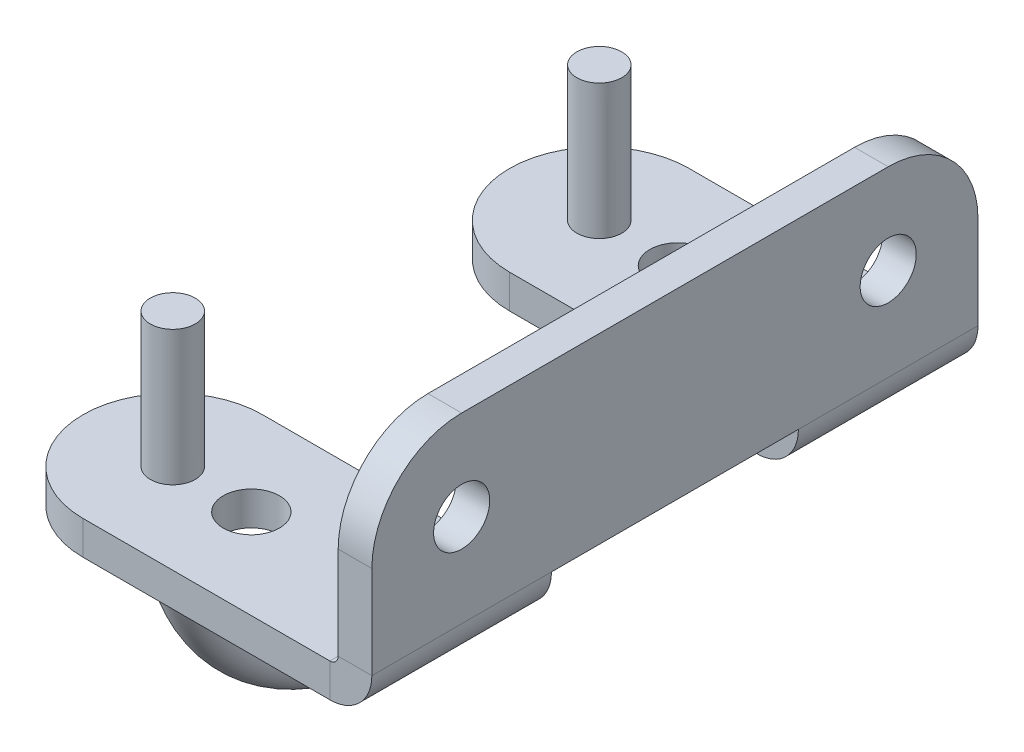
ISO-10303-21;
HEADER;
FILE_DESCRIPTION(('STEP AP214'),'2;1');
FILE_NAME('part.step','',(''),(''),'','','');
FILE_SCHEMA(('AUTOMOTIVE_DESIGN { 1 0 10303 214 1 1 1 1 }'));
ENDSEC;
DATA;
#1=APPLICATION_CONTEXT('core data for automotive mechanical design processes');
#2=APPLICATION_PROTOCOL_DEFINITION('international standard','automotive_design',2000,#1);
#3=PRODUCT_CONTEXT('',#1,'mechanical');
#4=PRODUCT('Part','Part','',(#3));
#5=PRODUCT_RELATED_PRODUCT_CATEGORY('part','',(#4));
#6=PRODUCT_DEFINITION_FORMATION('','',#4);
#7=PRODUCT_DEFINITION_CONTEXT('part definition',#1,'design');
#8=PRODUCT_DEFINITION('design','',#6,#7);
#9=PRODUCT_DEFINITION_SHAPE('','',#8);
#10=(LENGTH_UNIT() NAMED_UNIT(*) SI_UNIT(.MILLI.,.METRE.));
#11=(NAMED_UNIT(*) PLANE_ANGLE_UNIT() SI_UNIT($,.RADIAN.));
#12=(NAMED_UNIT(*) SI_UNIT($,.STERADIAN.) SOLID_ANGLE_UNIT());
#13=UNCERTAINTY_MEASURE_WITH_UNIT(LENGTH_MEASURE(1.E-05),#10,'distance_accuracy_value','');
#14=(GEOMETRIC_REPRESENTATION_CONTEXT(3) GLOBAL_UNCERTAINTY_ASSIGNED_CONTEXT((#13)) GLOBAL_UNIT_ASSIGNED_CONTEXT((#10,
#11,#12)) REPRESENTATION_CONTEXT('',''));
#15=CARTESIAN_POINT('',(0.,0.,0.));
#16=DIRECTION('',(0.,0.,1.));
#17=DIRECTION('',(1.,0.,0.));
#18=AXIS2_PLACEMENT_3D('',#15,#16,#17);
#19=CARTESIAN_POINT('',(25.7366,8.99999999999998,-38.));
#20=DIRECTION('',(-1.,0.,0.));
#21=DIRECTION('',(0.,-1.,0.));
#22=AXIS2_PLACEMENT_3D('',#19,#20,#21);
#23=CYLINDRICAL_SURFACE('',#22,8.);
#24=DIRECTION('',(-1.,0.,0.));
#25=VECTOR('',#24,1.);
#26=CARTESIAN_POINT('',(18.7366000000001,17.,-38.));
#27=LINE('',#26,#25);
#28=CARTESIAN_POINT('',(18.7366000000001,17.,-38.));
#29=VERTEX_POINT('',#28);
#30=CARTESIAN_POINT('',(15.7366000000001,17.,-38.));
#31=VERTEX_POINT('',#30);
#32=EDGE_CURVE('E309',#29,#31,#27,.T.);
#33=ORIENTED_EDGE('',*,*,#32,.F.);
#34=CARTESIAN_POINT('',(18.7366,9.,-38.));
#35=DIRECTION('',(1.,0.,0.));
#36=DIRECTION('',(0.,-1.,0.));
#37=AXIS2_PLACEMENT_3D('',#34,#35,#36);
#38=CIRCLE('',#37,8.);
#39=CARTESIAN_POINT('',(18.7366,9.00000000000001,-46.));
#40=VERTEX_POINT('',#39);
#41=EDGE_CURVE('E322',#29,#40,#38,.F.);
#42=ORIENTED_EDGE('',*,*,#41,.T.);
#43=DIRECTION('',(-1.,0.,0.));
#44=VECTOR('',#43,1.);
#45=CARTESIAN_POINT('',(25.7366,8.99999999999998,-46.));
#46=LINE('',#45,#44);
#47=CARTESIAN_POINT('',(15.7366,9.00000000000002,-46.));
#48=VERTEX_POINT('',#47);
#49=EDGE_CURVE('E372',#48,#40,#46,.F.);
#50=ORIENTED_EDGE('',*,*,#49,.F.);
#51=CARTESIAN_POINT('',(15.7366,9.00000000000001,-38.));
#52=DIRECTION('',(1.,0.,0.));
#53=DIRECTION('',(0.,-1.,0.));
#54=AXIS2_PLACEMENT_3D('',#51,#52,#53);
#55=CIRCLE('',#54,8.);
#56=EDGE_CURVE('E320',#31,#48,#55,.F.);
#57=ORIENTED_EDGE('',*,*,#56,.F.);
#58=EDGE_LOOP('',(#33,#42,#50,#57));
#59=FACE_BOUND('',#58,.T.);
#60=ADVANCED_FACE('F89',(#59),#23,.T.);
#61=CARTESIAN_POINT('',(18.7366,0.,-38.));
#62=DIRECTION('',(-1.,0.,0.));
#63=DIRECTION('',(0.,-1.,0.));
#64=AXIS2_PLACEMENT_3D('',#61,#62,#63);
#65=PLANE('',#64);
#66=DIRECTION('',(0.,0.,-1.));
#67=VECTOR('',#66,1.);
#68=CARTESIAN_POINT('',(18.7366,0.736599999999987,8.));
#69=LINE('',#68,#67);
#70=CARTESIAN_POINT('',(18.7366,0.736599999999985,-8.));
#71=VERTEX_POINT('',#70);
#72=CARTESIAN_POINT('',(18.7366,0.736599999999986,8.));
#73=VERTEX_POINT('',#72);
#74=EDGE_CURVE('E239',#71,#73,#69,.F.);
#75=ORIENTED_EDGE('',*,*,#74,.F.);
#76=DIRECTION('',(0.,0.,1.));
#77=VECTOR('',#76,1.);
#78=CARTESIAN_POINT('',(18.7366,0.736599999999985,-8.));
#79=LINE('',#78,#77);
#80=CARTESIAN_POINT('',(18.7366,0.736599999999985,-30.));
#81=VERTEX_POINT('',#80);
#82=EDGE_CURVE('E301',#81,#71,#79,.T.);
#83=ORIENTED_EDGE('',*,*,#82,.F.);
#84=DIRECTION('',(0.,0.,1.));
#85=VECTOR('',#84,1.);
#86=CARTESIAN_POINT('',(18.7366,0.736599999999987,-46.));
#87=LINE('',#86,#85);
#88=CARTESIAN_POINT('',(18.7366,0.736599999999986,-46.));
#89=VERTEX_POINT('',#88);
#90=EDGE_CURVE('E332',#81,#89,#87,.F.);
#91=ORIENTED_EDGE('',*,*,#90,.T.);
#92=DIRECTION('',(0.,-1.,0.));
#93=VECTOR('',#92,1.);
#94=CARTESIAN_POINT('',(18.7366,0.,-46.));
#95=LINE('',#94,#93);
#96=EDGE_CURVE('E325',#40,#89,#95,.T.);
#97=ORIENTED_EDGE('',*,*,#96,.F.);
#98=ORIENTED_EDGE('',*,*,#41,.F.);
#99=DIRECTION('',(0.,0.,-1.));
#100=VECTOR('',#99,1.);
#101=CARTESIAN_POINT('',(18.7366000000001,17.,-38.));
#102=LINE('',#101,#100);
#103=CARTESIAN_POINT('',(18.7366000000001,17.,0.));
#104=VERTEX_POINT('',#103);
#105=EDGE_CURVE('E304',#104,#29,#102,.T.);
#106=ORIENTED_EDGE('',*,*,#105,.F.);
#107=CARTESIAN_POINT('',(18.7366,9.,0.));
#108=DIRECTION('',(-1.,0.,0.));
#109=DIRECTION('',(0.,-1.,0.));
#110=AXIS2_PLACEMENT_3D('',#107,#108,#109);
#111=CIRCLE('',#110,8.);
#112=CARTESIAN_POINT('',(18.7366,9.00000000000001,8.));
#113=VERTEX_POINT('',#112);
#114=EDGE_CURVE('E221',#104,#113,#111,.F.);
#115=ORIENTED_EDGE('',*,*,#114,.T.);
#116=DIRECTION('',(0.,-1.,0.));
#117=VECTOR('',#116,1.);
#118=CARTESIAN_POINT('',(18.7366,0.,8.));
#119=LINE('',#118,#117);
#120=EDGE_CURVE('E229',#113,#73,#119,.T.);
#121=ORIENTED_EDGE('',*,*,#120,.T.);
#122=EDGE_LOOP('',(#75,#83,#91,#97,#98,#106,#115,#121));
#123=FACE_BOUND('',#122,.T.);
#124=CARTESIAN_POINT('',(18.7366,9.,-38.));
#125=DIRECTION('',(1.,0.,0.));
#126=DIRECTION('',(0.,-1.,0.));
#127=AXIS2_PLACEMENT_3D('',#124,#125,#126);
#128=CIRCLE('',#127,2.5);
#129=CARTESIAN_POINT('',(18.7366,6.5,-38.));
#130=VERTEX_POINT('',#129);
#131=EDGE_CURVE('E317',#130,#130,#128,.T.);
#132=ORIENTED_EDGE('',*,*,#131,.F.);
#133=EDGE_LOOP('',(#132));
#134=FACE_BOUND('',#133,.T.);
#135=CARTESIAN_POINT('',(18.7366,9.,0.));
#136=DIRECTION('',(-1.,0.,0.));
#137=DIRECTION('',(0.,-1.,0.));
#138=AXIS2_PLACEMENT_3D('',#135,#136,#137);
#139=CIRCLE('',#138,2.5);
#140=CARTESIAN_POINT('',(18.7366,6.5,0.));
#141=VERTEX_POINT('',#140);
#142=EDGE_CURVE('E222',#141,#141,#139,.T.);
#143=ORIENTED_EDGE('',*,*,#142,.T.);
#144=EDGE_LOOP('',(#143));
#145=FACE_BOUND('',#144,.T.);
#146=ADVANCED_FACE('F411',(#123,#134,#145),#65,.F.);
#147=CARTESIAN_POINT('',(15.7366,0.,-38.));
#148=DIRECTION('',(-1.,0.,0.));
#149=DIRECTION('',(0.,-1.,0.));
#150=AXIS2_PLACEMENT_3D('',#147,#148,#149);
#151=PLANE('',#150);
#152=DIRECTION('',(0.,0.,1.));
#153=VECTOR('',#152,1.);
#154=CARTESIAN_POINT('',(15.7366,0.736599999999996,-8.));
#155=LINE('',#154,#153);
#156=CARTESIAN_POINT('',(15.7366,0.736599999999996,-30.));
#157=VERTEX_POINT('',#156);
#158=CARTESIAN_POINT('',(15.7366,0.736599999999996,-8.));
#159=VERTEX_POINT('',#158);
#160=EDGE_CURVE('E230',#157,#159,#155,.T.);
#161=ORIENTED_EDGE('',*,*,#160,.T.);
#162=DIRECTION('',(0.,0.,-1.));
#163=VECTOR('',#162,1.);
#164=CARTESIAN_POINT('',(15.7366,0.736599999999997,8.));
#165=LINE('',#164,#163);
#166=CARTESIAN_POINT('',(15.7366,0.736599999999997,8.));
#167=VERTEX_POINT('',#166);
#168=EDGE_CURVE('E238',#167,#159,#165,.T.);
#169=ORIENTED_EDGE('',*,*,#168,.F.);
#170=DIRECTION('',(0.,1.,0.));
#171=VECTOR('',#170,1.);
#172=CARTESIAN_POINT('',(15.7366,0.,8.));
#173=LINE('',#172,#171);
#174=CARTESIAN_POINT('',(15.7366,9.00000000000002,8.));
#175=VERTEX_POINT('',#174);
#176=EDGE_CURVE('E227',#175,#167,#173,.F.);
#177=ORIENTED_EDGE('',*,*,#176,.F.);
#178=CARTESIAN_POINT('',(15.7366,9.00000000000001,0.));
#179=DIRECTION('',(-1.,0.,0.));
#180=DIRECTION('',(0.,-1.,0.));
#181=AXIS2_PLACEMENT_3D('',#178,#179,#180);
#182=CIRCLE('',#181,8.);
#183=CARTESIAN_POINT('',(15.7366000000001,17.,0.));
#184=VERTEX_POINT('',#183);
#185=EDGE_CURVE('E213',#184,#175,#182,.F.);
#186=ORIENTED_EDGE('',*,*,#185,.F.);
#187=DIRECTION('',(0.,0.,-1.));
#188=VECTOR('',#187,1.);
#189=CARTESIAN_POINT('',(15.7366000000001,17.,-38.));
#190=LINE('',#189,#188);
#191=EDGE_CURVE('E104',#184,#31,#190,.T.);
#192=ORIENTED_EDGE('',*,*,#191,.T.);
#193=ORIENTED_EDGE('',*,*,#56,.T.);
#194=DIRECTION('',(0.,1.,0.));
#195=VECTOR('',#194,1.);
#196=CARTESIAN_POINT('',(15.7366,0.,-46.));
#197=LINE('',#196,#195);
#198=CARTESIAN_POINT('',(15.7366,0.736599999999997,-46.));
#199=VERTEX_POINT('',#198);
#200=EDGE_CURVE('E329',#48,#199,#197,.F.);
#201=ORIENTED_EDGE('',*,*,#200,.T.);
#202=DIRECTION('',(0.,0.,1.));
#203=VECTOR('',#202,1.);
#204=CARTESIAN_POINT('',(15.7366,0.736599999999997,-46.));
#205=LINE('',#204,#203);
#206=EDGE_CURVE('E337',#199,#157,#205,.T.);
#207=ORIENTED_EDGE('',*,*,#206,.T.);
#208=EDGE_LOOP('',(#161,#169,#177,#186,#192,#193,#201,#207));
#209=FACE_BOUND('',#208,.T.);
#210=CARTESIAN_POINT('',(15.7366,9.00000000000001,-38.));
#211=DIRECTION('',(1.,0.,0.));
#212=DIRECTION('',(0.,-1.,0.));
#213=AXIS2_PLACEMENT_3D('',#210,#211,#212);
#214=CIRCLE('',#213,2.5);
#215=CARTESIAN_POINT('',(15.7366,6.50000000000001,-38.));
#216=VERTEX_POINT('',#215);
#217=EDGE_CURVE('E311',#216,#216,#214,.T.);
#218=ORIENTED_EDGE('',*,*,#217,.T.);
#219=EDGE_LOOP('',(#218));
#220=FACE_BOUND('',#219,.T.);
#221=CARTESIAN_POINT('',(15.7366,9.00000000000001,0.));
#222=DIRECTION('',(-1.,0.,0.));
#223=DIRECTION('',(0.,-1.,0.));
#224=AXIS2_PLACEMENT_3D('',#221,#222,#223);
#225=CIRCLE('',#224,2.5);
#226=CARTESIAN_POINT('',(15.7366,6.50000000000001,0.));
#227=VERTEX_POINT('',#226);
#228=EDGE_CURVE('E866',#227,#227,#225,.T.);
#229=ORIENTED_EDGE('',*,*,#228,.F.);
#230=EDGE_LOOP('',(#229));
#231=FACE_BOUND('',#230,.T.);
#232=ADVANCED_FACE('F235',(#209,#220,#231),#151,.T.);
#233=CARTESIAN_POINT('',(18.7366,0.,-46.));
#234=DIRECTION('',(0.,0.,1.));
#235=DIRECTION('',(-1.,0.,0.));
#236=AXIS2_PLACEMENT_3D('',#233,#234,#235);
#237=PLANE('',#236);
#238=ORIENTED_EDGE('',*,*,#49,.T.);
#239=ORIENTED_EDGE('',*,*,#96,.T.);
#240=DIRECTION('',(-1.,0.,0.));
#241=VECTOR('',#240,1.);
#242=CARTESIAN_POINT('',(18.7366,0.736599999999987,-46.));
#243=LINE('',#242,#241);
#244=EDGE_CURVE('E324',#199,#89,#243,.F.);
#245=ORIENTED_EDGE('',*,*,#244,.F.);
#246=ORIENTED_EDGE('',*,*,#200,.F.);
#247=EDGE_LOOP('',(#238,#239,#245,#246));
#248=FACE_BOUND('',#247,.T.);
#249=ADVANCED_FACE('F428',(#248),#237,.F.);
#250=CARTESIAN_POINT('',(15.,-3.,-46.));
#251=DIRECTION('',(0.,0.,-1.));
#252=DIRECTION('',(1.,0.,0.));
#253=AXIS2_PLACEMENT_3D('',#250,#251,#252);
#254=PLANE('',#253);
#255=DIRECTION('',(1.,0.,0.));
#256=VECTOR('',#255,1.);
#257=CARTESIAN_POINT('',(15.,0.,-46.));
#258=LINE('',#257,#256);
#259=CARTESIAN_POINT('',(-7.,0.,-46.));
#260=VERTEX_POINT('',#259);
#261=CARTESIAN_POINT('',(15.,0.,-46.));
#262=VERTEX_POINT('',#261);
#263=EDGE_CURVE('E355',#260,#262,#258,.T.);
#264=ORIENTED_EDGE('',*,*,#263,.T.);
#265=DIRECTION('',(0.,1.,0.));
#266=VECTOR('',#265,1.);
#267=CARTESIAN_POINT('',(15.,-3.,-46.));
#268=LINE('',#267,#266);
#269=CARTESIAN_POINT('',(15.,-3.,-46.));
#270=VERTEX_POINT('',#269);
#271=EDGE_CURVE('E370',#270,#262,#268,.T.);
#272=ORIENTED_EDGE('',*,*,#271,.F.);
#273=DIRECTION('',(1.,0.,0.));
#274=VECTOR('',#273,1.);
#275=CARTESIAN_POINT('',(0.,-3.,-46.));
#276=LINE('',#275,#274);
#277=CARTESIAN_POINT('',(-7.,-3.,-46.));
#278=VERTEX_POINT('',#277);
#279=EDGE_CURVE('E359',#278,#270,#276,.T.);
#280=ORIENTED_EDGE('',*,*,#279,.F.);
#281=DIRECTION('',(0.,1.,0.));
#282=VECTOR('',#281,1.);
#283=CARTESIAN_POINT('',(-7.,-3.,-46.));
#284=LINE('',#283,#282);
#285=EDGE_CURVE('E373',#278,#260,#284,.T.);
#286=ORIENTED_EDGE('',*,*,#285,.T.);
#287=EDGE_LOOP('',(#264,#272,#280,#286));
#288=FACE_BOUND('',#287,.T.);
#289=ADVANCED_FACE('F435',(#288),#254,.T.);
#290=CARTESIAN_POINT('',(-7.,-3.,-38.));
#291=DIRECTION('',(0.,1.,0.));
#292=DIRECTION('',(0.,0.,-1.));
#293=AXIS2_PLACEMENT_3D('',#290,#291,#292);
#294=CYLINDRICAL_SURFACE('',#293,8.);
#295=CARTESIAN_POINT('',(-7.,0.,-38.));
#296=DIRECTION('',(0.,-1.,0.));
#297=DIRECTION('',(0.,0.,1.));
#298=AXIS2_PLACEMENT_3D('',#295,#296,#297);
#299=CIRCLE('',#298,8.);
#300=CARTESIAN_POINT('',(-7.,0.,-30.));
#301=VERTEX_POINT('',#300);
#302=EDGE_CURVE('E366',#301,#260,#299,.T.);
#303=ORIENTED_EDGE('',*,*,#302,.T.);
#304=ORIENTED_EDGE('',*,*,#285,.F.);
#305=CARTESIAN_POINT('',(-7.,-3.,-38.));
#306=DIRECTION('',(0.,-1.,0.));
#307=DIRECTION('',(0.,0.,1.));
#308=AXIS2_PLACEMENT_3D('',#305,#306,#307);
#309=CIRCLE('',#308,8.);
#310=CARTESIAN_POINT('',(-7.,-3.,-30.));
#311=VERTEX_POINT('',#310);
#312=EDGE_CURVE('E357',#311,#278,#309,.T.);
#313=ORIENTED_EDGE('',*,*,#312,.F.);
#314=DIRECTION('',(0.,1.,0.));
#315=VECTOR('',#314,1.);
#316=CARTESIAN_POINT('',(-7.,-3.,-30.));
#317=LINE('',#316,#315);
#318=EDGE_CURVE('E376',#311,#301,#317,.T.);
#319=ORIENTED_EDGE('',*,*,#318,.T.);
#320=EDGE_LOOP('',(#303,#304,#313,#319));
#321=FACE_BOUND('',#320,.T.);
#322=ADVANCED_FACE('F444',(#321),#294,.T.);
#323=CARTESIAN_POINT('',(0.,-3.,-30.));
#324=DIRECTION('',(0.,0.,1.));
#325=DIRECTION('',(-1.,0.,0.));
#326=AXIS2_PLACEMENT_3D('',#323,#324,#325);
#327=PLANE('',#326);
#328=DIRECTION('',(-1.,0.,0.));
#329=VECTOR('',#328,1.);
#330=CARTESIAN_POINT('',(0.,0.,-30.));
#331=LINE('',#330,#329);
#332=CARTESIAN_POINT('',(15.,0.,-30.));
#333=VERTEX_POINT('',#332);
#334=EDGE_CURVE('E364',#333,#301,#331,.T.);
#335=ORIENTED_EDGE('',*,*,#334,.T.);
#336=ORIENTED_EDGE('',*,*,#318,.F.);
#337=DIRECTION('',(-1.,0.,0.));
#338=VECTOR('',#337,1.);
#339=CARTESIAN_POINT('',(15.,-3.,-30.));
#340=LINE('',#339,#338);
#341=CARTESIAN_POINT('',(15.,-3.,-30.));
#342=VERTEX_POINT('',#341);
#343=EDGE_CURVE('E141',#342,#311,#340,.T.);
#344=ORIENTED_EDGE('',*,*,#343,.F.);
#345=DIRECTION('',(0.,1.,0.));
#346=VECTOR('',#345,1.);
#347=CARTESIAN_POINT('',(15.,-3.,-30.));
#348=LINE('',#347,#346);
#349=EDGE_CURVE('E362',#342,#333,#348,.T.);
#350=ORIENTED_EDGE('',*,*,#349,.T.);
#351=EDGE_LOOP('',(#335,#336,#344,#350));
#352=FACE_BOUND('',#351,.T.);
#353=ADVANCED_FACE('F91',(#352),#327,.T.);
#354=CARTESIAN_POINT('',(-7.,-3.,-38.));
#355=DIRECTION('',(0.,-1.,0.));
#356=DIRECTION('',(0.,0.,1.));
#357=AXIS2_PLACEMENT_3D('',#354,#355,#356);
#358=PLANE('',#357);
#359=CARTESIAN_POINT('',(-7.,-3.,-38.));
#360=DIRECTION('',(0.,-1.,0.));
#361=DIRECTION('',(0.,0.,-1.));
#362=AXIS2_PLACEMENT_3D('',#359,#360,#361);
#363=CIRCLE('',#362,2.);
#364=CARTESIAN_POINT('',(-7.,-3.,-40.));
#365=VERTEX_POINT('',#364);
#366=EDGE_CURVE('E13',#365,#365,#363,.T.);
#367=ORIENTED_EDGE('',*,*,#366,.F.);
#368=EDGE_LOOP('',(#367));
#369=FACE_BOUND('',#368,.T.);
#370=CARTESIAN_POINT('',(0.,-3.,-38.));
#371=DIRECTION('',(0.,-1.,0.));
#372=DIRECTION('',(0.,0.,-1.));
#373=AXIS2_PLACEMENT_3D('',#370,#371,#372);
#374=CIRCLE('',#373,2.5);
#375=CARTESIAN_POINT('',(0.,-3.,-40.5));
#376=VERTEX_POINT('',#375);
#377=EDGE_CURVE('E347',#376,#376,#374,.T.);
#378=ORIENTED_EDGE('',*,*,#377,.F.);
#379=EDGE_LOOP('',(#378));
#380=FACE_BOUND('',#379,.T.);
#381=DIRECTION('',(0.,0.,1.));
#382=VECTOR('',#381,1.);
#383=CARTESIAN_POINT('',(15.,-3.,-46.));
#384=LINE('',#383,#382);
#385=EDGE_CURVE('E353',#270,#342,#384,.T.);
#386=ORIENTED_EDGE('',*,*,#385,.T.);
#387=ORIENTED_EDGE('',*,*,#343,.T.);
#388=ORIENTED_EDGE('',*,*,#312,.T.);
#389=ORIENTED_EDGE('',*,*,#279,.T.);
#390=EDGE_LOOP('',(#386,#387,#388,#389));
#391=FACE_BOUND('',#390,.T.);
#392=ADVANCED_FACE('F445',(#369,#380,#391),#358,.T.);
#393=CARTESIAN_POINT('',(-7.,0.,-38.));
#394=DIRECTION('',(0.,-1.,0.));
#395=DIRECTION('',(0.,0.,1.));
#396=AXIS2_PLACEMENT_3D('',#393,#394,#395);
#397=PLANE('',#396);
#398=CARTESIAN_POINT('',(-6.99999999999999,0.,-38.));
#399=DIRECTION('',(0.,-1.,0.));
#400=DIRECTION('',(0.,0.,-1.));
#401=AXIS2_PLACEMENT_3D('',#398,#399,#400);
#402=CIRCLE('',#401,2.);
#403=CARTESIAN_POINT('',(-6.99999999999999,0.,-40.));
#404=VERTEX_POINT('',#403);
#405=EDGE_CURVE('E861',#404,#404,#402,.F.);
#406=ORIENTED_EDGE('',*,*,#405,.F.);
#407=EDGE_LOOP('',(#406));
#408=FACE_BOUND('',#407,.T.);
#409=CARTESIAN_POINT('',(0.,0.,-38.));
#410=DIRECTION('',(0.,-1.,0.));
#411=DIRECTION('',(0.,0.,-1.));
#412=AXIS2_PLACEMENT_3D('',#409,#410,#411);
#413=CIRCLE('',#412,2.5);
#414=CARTESIAN_POINT('',(0.,0.,-40.5));
#415=VERTEX_POINT('',#414);
#416=EDGE_CURVE('E342',#415,#415,#413,.T.);
#417=ORIENTED_EDGE('',*,*,#416,.T.);
#418=EDGE_LOOP('',(#417));
#419=FACE_BOUND('',#418,.T.);
#420=DIRECTION('',(0.,0.,1.));
#421=VECTOR('',#420,1.);
#422=CARTESIAN_POINT('',(15.,0.,-46.));
#423=LINE('',#422,#421);
#424=EDGE_CURVE('E350',#262,#333,#423,.T.);
#425=ORIENTED_EDGE('',*,*,#424,.F.);
#426=ORIENTED_EDGE('',*,*,#263,.F.);
#427=ORIENTED_EDGE('',*,*,#302,.F.);
#428=ORIENTED_EDGE('',*,*,#334,.F.);
#429=EDGE_LOOP('',(#425,#426,#427,#428));
#430=FACE_BOUND('',#429,.T.);
#431=ADVANCED_FACE('F439',(#408,#419,#430),#397,.F.);
#432=CARTESIAN_POINT('',(0.,-3.,-38.));
#433=DIRECTION('',(0.,1.,0.));
#434=DIRECTION('',(0.,0.,-1.));
#435=AXIS2_PLACEMENT_3D('',#432,#433,#434);
#436=CYLINDRICAL_SURFACE('',#435,2.5);
#437=ORIENTED_EDGE('',*,*,#377,.T.);
#438=EDGE_LOOP('',(#437));
#439=FACE_BOUND('',#438,.T.);
#440=ORIENTED_EDGE('',*,*,#416,.F.);
#441=EDGE_LOOP('',(#440));
#442=FACE_BOUND('',#441,.T.);
#443=ADVANCED_FACE('F482',(#439,#442),#436,.F.);
#444=CARTESIAN_POINT('',(15.,0.736599999999999,-46.));
#445=DIRECTION('',(0.,0.,-1.));
#446=DIRECTION('',(0.,-1.,0.));
#447=AXIS2_PLACEMENT_3D('',#444,#445,#446);
#448=PLANE('',#447);
#449=ORIENTED_EDGE('',*,*,#244,.T.);
#450=CARTESIAN_POINT('',(15.,0.736599999999999,-46.));
#451=DIRECTION('',(0.,0.,-1.));
#452=DIRECTION('',(0.,1.,0.));
#453=AXIS2_PLACEMENT_3D('',#450,#451,#452);
#454=CIRCLE('',#453,3.7366);
#455=EDGE_CURVE('E113',#270,#89,#454,.F.);
#456=ORIENTED_EDGE('',*,*,#455,.F.);
#457=ORIENTED_EDGE('',*,*,#271,.T.);
#458=CARTESIAN_POINT('',(15.,0.736599999999999,-46.));
#459=DIRECTION('',(0.,0.,-1.));
#460=DIRECTION('',(0.,1.,0.));
#461=AXIS2_PLACEMENT_3D('',#458,#459,#460);
#462=CIRCLE('',#461,0.736600000000002);
#463=EDGE_CURVE('E135',#262,#199,#462,.F.);
#464=ORIENTED_EDGE('',*,*,#463,.T.);
#465=EDGE_LOOP('',(#449,#456,#457,#464));
#466=FACE_BOUND('',#465,.T.);
#467=ADVANCED_FACE('F430',(#466),#448,.T.);
#468=CARTESIAN_POINT('',(15.,0.736599999999998,-30.));
#469=DIRECTION('',(0.,0.,-1.));
#470=DIRECTION('',(0.,-1.,0.));
#471=AXIS2_PLACEMENT_3D('',#468,#469,#470);
#472=PLANE('',#471);
#473=CARTESIAN_POINT('',(15.,0.736599999999998,-30.));
#474=DIRECTION('',(0.,0.,-1.));
#475=DIRECTION('',(0.,1.,0.));
#476=AXIS2_PLACEMENT_3D('',#473,#474,#475);
#477=CIRCLE('',#476,0.736600000000002);
#478=EDGE_CURVE('E328',#157,#333,#477,.T.);
#479=ORIENTED_EDGE('',*,*,#478,.T.);
#480=ORIENTED_EDGE('',*,*,#349,.F.);
#481=CARTESIAN_POINT('',(15.,0.736599999999998,-30.));
#482=DIRECTION('',(0.,0.,-1.));
#483=DIRECTION('',(0.,1.,0.));
#484=AXIS2_PLACEMENT_3D('',#481,#482,#483);
#485=CIRCLE('',#484,3.7366);
#486=EDGE_CURVE('E343',#81,#342,#485,.T.);
#487=ORIENTED_EDGE('',*,*,#486,.F.);
#488=DIRECTION('',(-1.,0.,0.));
#489=VECTOR('',#488,1.);
#490=CARTESIAN_POINT('',(15.7366,0.736599999999995,-30.));
#491=LINE('',#490,#489);
#492=EDGE_CURVE('E335',#157,#81,#491,.F.);
#493=ORIENTED_EDGE('',*,*,#492,.F.);
#494=EDGE_LOOP('',(#479,#480,#487,#493));
#495=FACE_BOUND('',#494,.T.);
#496=ADVANCED_FACE('F419',(#495),#472,.F.);
#497=CARTESIAN_POINT('',(15.,0.736599999999998,-30.));
#498=DIRECTION('',(0.,0.,1.));
#499=DIRECTION('',(1.,0.,0.));
#500=AXIS2_PLACEMENT_3D('',#497,#498,#499);
#501=CYLINDRICAL_SURFACE('',#500,3.7366);
#502=ORIENTED_EDGE('',*,*,#385,.F.);
#503=ORIENTED_EDGE('',*,*,#455,.T.);
#504=ORIENTED_EDGE('',*,*,#90,.F.);
#505=ORIENTED_EDGE('',*,*,#486,.T.);
#506=EDGE_LOOP('',(#502,#503,#504,#505));
#507=FACE_BOUND('',#506,.T.);
#508=ADVANCED_FACE('F447',(#507),#501,.T.);
#509=CARTESIAN_POINT('',(15.,0.736599999999998,-30.));
#510=DIRECTION('',(0.,0.,1.));
#511=DIRECTION('',(1.,0.,0.));
#512=AXIS2_PLACEMENT_3D('',#509,#510,#511);
#513=CYLINDRICAL_SURFACE('',#512,0.736600000000002);
#514=ORIENTED_EDGE('',*,*,#424,.T.);
#515=ORIENTED_EDGE('',*,*,#478,.F.);
#516=ORIENTED_EDGE('',*,*,#206,.F.);
#517=ORIENTED_EDGE('',*,*,#463,.F.);
#518=EDGE_LOOP('',(#514,#515,#516,#517));
#519=FACE_BOUND('',#518,.T.);
#520=ADVANCED_FACE('F422',(#519),#513,.F.);
#521=CARTESIAN_POINT('',(25.7366,8.99999999999998,-38.));
#522=DIRECTION('',(-1.,0.,0.));
#523=DIRECTION('',(0.,-1.,0.));
#524=AXIS2_PLACEMENT_3D('',#521,#522,#523);
#525=CYLINDRICAL_SURFACE('',#524,2.5);
#526=ORIENTED_EDGE('',*,*,#217,.F.);
#527=EDGE_LOOP('',(#526));
#528=FACE_BOUND('',#527,.T.);
#529=ORIENTED_EDGE('',*,*,#131,.T.);
#530=EDGE_LOOP('',(#529));
#531=FACE_BOUND('',#530,.T.);
#532=ADVANCED_FACE('F455',(#528,#531),#525,.F.);
#533=CARTESIAN_POINT('',(18.7366000000001,17.,-38.));
#534=DIRECTION('',(0.,1.,0.));
#535=DIRECTION('',(-1.,0.,0.));
#536=AXIS2_PLACEMENT_3D('',#533,#534,#535);
#537=PLANE('',#536);
#538=ORIENTED_EDGE('',*,*,#191,.F.);
#539=DIRECTION('',(-1.,0.,0.));
#540=VECTOR('',#539,1.);
#541=CARTESIAN_POINT('',(18.7366000000001,17.,0.));
#542=LINE('',#541,#540);
#543=EDGE_CURVE('E219',#104,#184,#542,.T.);
#544=ORIENTED_EDGE('',*,*,#543,.F.);
#545=ORIENTED_EDGE('',*,*,#105,.T.);
#546=ORIENTED_EDGE('',*,*,#32,.T.);
#547=EDGE_LOOP('',(#538,#544,#545,#546));
#548=FACE_BOUND('',#547,.T.);
#549=ADVANCED_FACE('F453',(#548),#537,.T.);
#550=CARTESIAN_POINT('',(18.7366,0.736599999999985,-8.));
#551=DIRECTION('',(0.,-1.,0.));
#552=DIRECTION('',(1.,0.,0.));
#553=AXIS2_PLACEMENT_3D('',#550,#551,#552);
#554=PLANE('',#553);
#555=ORIENTED_EDGE('',*,*,#160,.F.);
#556=ORIENTED_EDGE('',*,*,#492,.T.);
#557=ORIENTED_EDGE('',*,*,#82,.T.);
#558=DIRECTION('',(-1.,0.,0.));
#559=VECTOR('',#558,1.);
#560=CARTESIAN_POINT('',(18.7366,0.736599999999985,-8.));
#561=LINE('',#560,#559);
#562=EDGE_CURVE('E306',#71,#159,#561,.T.);
#563=ORIENTED_EDGE('',*,*,#562,.T.);
#564=EDGE_LOOP('',(#555,#556,#557,#563));
#565=FACE_BOUND('',#564,.T.);
#566=ADVANCED_FACE('F415',(#565),#554,.T.);
#567=CARTESIAN_POINT('',(18.7366,0.,8.));
#568=DIRECTION('',(0.,0.,-1.));
#569=DIRECTION('',(-1.,0.,0.));
#570=AXIS2_PLACEMENT_3D('',#567,#568,#569);
#571=PLANE('',#570);
#572=DIRECTION('',(-1.,0.,0.));
#573=VECTOR('',#572,1.);
#574=CARTESIAN_POINT('',(25.7366,8.99999999999998,8.));
#575=LINE('',#574,#573);
#576=EDGE_CURVE('E216',#175,#113,#575,.F.);
#577=ORIENTED_EDGE('',*,*,#576,.F.);
#578=ORIENTED_EDGE('',*,*,#176,.T.);
#579=DIRECTION('',(-1.,0.,0.));
#580=VECTOR('',#579,1.);
#581=CARTESIAN_POINT('',(18.7366,0.736599999999987,8.));
#582=LINE('',#581,#580);
#583=EDGE_CURVE('E248',#167,#73,#582,.F.);
#584=ORIENTED_EDGE('',*,*,#583,.T.);
#585=ORIENTED_EDGE('',*,*,#120,.F.);
#586=EDGE_LOOP('',(#577,#578,#584,#585));
#587=FACE_BOUND('',#586,.T.);
#588=ADVANCED_FACE('F225',(#587),#571,.F.);
#589=CARTESIAN_POINT('',(15.,-3.,8.));
#590=DIRECTION('',(0.,0.,1.));
#591=DIRECTION('',(1.,0.,0.));
#592=AXIS2_PLACEMENT_3D('',#589,#590,#591);
#593=PLANE('',#592);
#594=DIRECTION('',(1.,0.,0.));
#595=VECTOR('',#594,1.);
#596=CARTESIAN_POINT('',(15.,0.,8.));
#597=LINE('',#596,#595);
#598=CARTESIAN_POINT('',(-7.,0.,8.));
#599=VERTEX_POINT('',#598);
#600=CARTESIAN_POINT('',(15.,0.,8.));
#601=VERTEX_POINT('',#600);
#602=EDGE_CURVE('E275',#599,#601,#597,.T.);
#603=ORIENTED_EDGE('',*,*,#602,.F.);
#604=DIRECTION('',(0.,1.,0.));
#605=VECTOR('',#604,1.);
#606=CARTESIAN_POINT('',(-7.,-3.,8.));
#607=LINE('',#606,#605);
#608=CARTESIAN_POINT('',(-7.,-3.,8.));
#609=VERTEX_POINT('',#608);
#610=EDGE_CURVE('E294',#609,#599,#607,.T.);
#611=ORIENTED_EDGE('',*,*,#610,.F.);
#612=DIRECTION('',(1.,0.,0.));
#613=VECTOR('',#612,1.);
#614=CARTESIAN_POINT('',(0.,-3.,8.));
#615=LINE('',#614,#613);
#616=CARTESIAN_POINT('',(15.,-3.,8.));
#617=VERTEX_POINT('',#616);
#618=EDGE_CURVE('E280',#609,#617,#615,.T.);
#619=ORIENTED_EDGE('',*,*,#618,.T.);
#620=DIRECTION('',(0.,1.,0.));
#621=VECTOR('',#620,1.);
#622=CARTESIAN_POINT('',(15.,-3.,8.));
#623=LINE('',#622,#621);
#624=EDGE_CURVE('E231',#617,#601,#623,.T.);
#625=ORIENTED_EDGE('',*,*,#624,.T.);
#626=EDGE_LOOP('',(#603,#611,#619,#625));
#627=FACE_BOUND('',#626,.T.);
#628=ADVANCED_FACE('F736',(#627),#593,.T.);
#629=CARTESIAN_POINT('',(-7.,-3.,0.));
#630=DIRECTION('',(0.,1.,0.));
#631=DIRECTION('',(0.,0.,1.));
#632=AXIS2_PLACEMENT_3D('',#629,#630,#631);
#633=CYLINDRICAL_SURFACE('',#632,8.);
#634=CARTESIAN_POINT('',(-7.,0.,0.));
#635=DIRECTION('',(0.,1.,0.));
#636=DIRECTION('',(0.,0.,-1.));
#637=AXIS2_PLACEMENT_3D('',#634,#635,#636);
#638=CIRCLE('',#637,8.);
#639=CARTESIAN_POINT('',(-7.,0.,-8.));
#640=VERTEX_POINT('',#639);
#641=EDGE_CURVE('E288',#640,#599,#638,.T.);
#642=ORIENTED_EDGE('',*,*,#641,.F.);
#643=DIRECTION('',(0.,1.,0.));
#644=VECTOR('',#643,1.);
#645=CARTESIAN_POINT('',(-7.,-3.,-8.));
#646=LINE('',#645,#644);
#647=CARTESIAN_POINT('',(-7.,-3.,-8.));
#648=VERTEX_POINT('',#647);
#649=EDGE_CURVE('E297',#648,#640,#646,.T.);
#650=ORIENTED_EDGE('',*,*,#649,.F.);
#651=CARTESIAN_POINT('',(-7.,-3.,0.));
#652=DIRECTION('',(0.,1.,0.));
#653=DIRECTION('',(0.,0.,-1.));
#654=AXIS2_PLACEMENT_3D('',#651,#652,#653);
#655=CIRCLE('',#654,8.);
#656=EDGE_CURVE('E277',#648,#609,#655,.T.);
#657=ORIENTED_EDGE('',*,*,#656,.T.);
#658=ORIENTED_EDGE('',*,*,#610,.T.);
#659=EDGE_LOOP('',(#642,#650,#657,#658));
#660=FACE_BOUND('',#659,.T.);
#661=ADVANCED_FACE('F724',(#660),#633,.T.);
#662=CARTESIAN_POINT('',(0.,-3.,-8.));
#663=DIRECTION('',(0.,0.,-1.));
#664=DIRECTION('',(-1.,0.,0.));
#665=AXIS2_PLACEMENT_3D('',#662,#663,#664);
#666=PLANE('',#665);
#667=DIRECTION('',(-1.,0.,0.));
#668=VECTOR('',#667,1.);
#669=CARTESIAN_POINT('',(0.,0.,-8.));
#670=LINE('',#669,#668);
#671=CARTESIAN_POINT('',(15.,0.,-8.));
#672=VERTEX_POINT('',#671);
#673=EDGE_CURVE('E285',#672,#640,#670,.T.);
#674=ORIENTED_EDGE('',*,*,#673,.F.);
#675=DIRECTION('',(0.,1.,0.));
#676=VECTOR('',#675,1.);
#677=CARTESIAN_POINT('',(15.,-3.,-8.));
#678=LINE('',#677,#676);
#679=CARTESIAN_POINT('',(15.,-3.,-8.));
#680=VERTEX_POINT('',#679);
#681=EDGE_CURVE('E282',#680,#672,#678,.T.);
#682=ORIENTED_EDGE('',*,*,#681,.F.);
#683=DIRECTION('',(-1.,0.,0.));
#684=VECTOR('',#683,1.);
#685=CARTESIAN_POINT('',(15.,-3.,-8.));
#686=LINE('',#685,#684);
#687=EDGE_CURVE('E274',#680,#648,#686,.T.);
#688=ORIENTED_EDGE('',*,*,#687,.T.);
#689=ORIENTED_EDGE('',*,*,#649,.T.);
#690=EDGE_LOOP('',(#674,#682,#688,#689));
#691=FACE_BOUND('',#690,.T.);
#692=ADVANCED_FACE('F391',(#691),#666,.T.);
#693=CARTESIAN_POINT('',(-7.,-3.,0.));
#694=DIRECTION('',(0.,-1.,0.));
#695=DIRECTION('',(0.,0.,-1.));
#696=AXIS2_PLACEMENT_3D('',#693,#694,#695);
#697=PLANE('',#696);
#698=CARTESIAN_POINT('',(-7.,-3.,0.));
#699=DIRECTION('',(0.,-1.,0.));
#700=DIRECTION('',(0.,0.,-1.));
#701=AXIS2_PLACEMENT_3D('',#698,#699,#700);
#702=CIRCLE('',#701,2.);
#703=CARTESIAN_POINT('',(-7.,-3.,2.));
#704=VERTEX_POINT('',#703);
#705=EDGE_CURVE('E97',#704,#704,#702,.T.);
#706=ORIENTED_EDGE('',*,*,#705,.F.);
#707=EDGE_LOOP('',(#706));
#708=FACE_BOUND('',#707,.T.);
#709=CARTESIAN_POINT('',(0.,-3.,0.));
#710=DIRECTION('',(0.,1.,0.));
#711=DIRECTION('',(0.,0.,1.));
#712=AXIS2_PLACEMENT_3D('',#709,#710,#711);
#713=CIRCLE('',#712,2.5);
#714=CARTESIAN_POINT('',(0.,-3.,2.5));
#715=VERTEX_POINT('',#714);
#716=EDGE_CURVE('E265',#715,#715,#713,.T.);
#717=ORIENTED_EDGE('',*,*,#716,.T.);
#718=EDGE_LOOP('',(#717));
#719=FACE_BOUND('',#718,.T.);
#720=DIRECTION('',(0.,0.,-1.));
#721=VECTOR('',#720,1.);
#722=CARTESIAN_POINT('',(15.,-3.,8.));
#723=LINE('',#722,#721);
#724=EDGE_CURVE('E271',#617,#680,#723,.T.);
#725=ORIENTED_EDGE('',*,*,#724,.F.);
#726=ORIENTED_EDGE('',*,*,#618,.F.);
#727=ORIENTED_EDGE('',*,*,#656,.F.);
#728=ORIENTED_EDGE('',*,*,#687,.F.);
#729=EDGE_LOOP('',(#725,#726,#727,#728));
#730=FACE_BOUND('',#729,.T.);
#731=ADVANCED_FACE('F387',(#708,#719,#730),#697,.T.);
#732=CARTESIAN_POINT('',(-7.,0.,0.));
#733=DIRECTION('',(0.,-1.,0.));
#734=DIRECTION('',(0.,0.,-1.));
#735=AXIS2_PLACEMENT_3D('',#732,#733,#734);
#736=PLANE('',#735);
#737=CARTESIAN_POINT('',(-7.,0.,0.));
#738=DIRECTION('',(0.,1.,0.));
#739=DIRECTION('',(0.,0.,1.));
#740=AXIS2_PLACEMENT_3D('',#737,#738,#739);
#741=CIRCLE('',#740,2.);
#742=CARTESIAN_POINT('',(-7.,0.,2.));
#743=VERTEX_POINT('',#742);
#744=EDGE_CURVE('E253',#743,#743,#741,.T.);
#745=ORIENTED_EDGE('',*,*,#744,.F.);
#746=EDGE_LOOP('',(#745));
#747=FACE_BOUND('',#746,.T.);
#748=CARTESIAN_POINT('',(0.,0.,0.));
#749=DIRECTION('',(0.,1.,0.));
#750=DIRECTION('',(0.,0.,1.));
#751=AXIS2_PLACEMENT_3D('',#748,#749,#750);
#752=CIRCLE('',#751,2.5);
#753=CARTESIAN_POINT('',(0.,0.,2.5));
#754=VERTEX_POINT('',#753);
#755=EDGE_CURVE('E264',#754,#754,#752,.T.);
#756=ORIENTED_EDGE('',*,*,#755,.F.);
#757=EDGE_LOOP('',(#756));
#758=FACE_BOUND('',#757,.T.);
#759=DIRECTION('',(0.,0.,-1.));
#760=VECTOR('',#759,1.);
#761=CARTESIAN_POINT('',(15.,0.,8.));
#762=LINE('',#761,#760);
#763=EDGE_CURVE('E268',#601,#672,#762,.T.);
#764=ORIENTED_EDGE('',*,*,#763,.T.);
#765=ORIENTED_EDGE('',*,*,#673,.T.);
#766=ORIENTED_EDGE('',*,*,#641,.T.);
#767=ORIENTED_EDGE('',*,*,#602,.T.);
#768=EDGE_LOOP('',(#764,#765,#766,#767));
#769=FACE_BOUND('',#768,.T.);
#770=ADVANCED_FACE('F390',(#747,#758,#769),#736,.F.);
#771=CARTESIAN_POINT('',(0.,-3.,0.));
#772=DIRECTION('',(0.,1.,0.));
#773=DIRECTION('',(0.,0.,1.));
#774=AXIS2_PLACEMENT_3D('',#771,#772,#773);
#775=CYLINDRICAL_SURFACE('',#774,2.5);
#776=ORIENTED_EDGE('',*,*,#716,.F.);
#777=EDGE_LOOP('',(#776));
#778=FACE_BOUND('',#777,.T.);
#779=ORIENTED_EDGE('',*,*,#755,.T.);
#780=EDGE_LOOP('',(#779));
#781=FACE_BOUND('',#780,.T.);
#782=ADVANCED_FACE('F692',(#778,#781),#775,.F.);
#783=CARTESIAN_POINT('',(15.,0.736599999999999,8.));
#784=DIRECTION('',(0.,0.,1.));
#785=DIRECTION('',(0.,-1.,0.));
#786=AXIS2_PLACEMENT_3D('',#783,#784,#785);
#787=PLANE('',#786);
#788=ORIENTED_EDGE('',*,*,#583,.F.);
#789=CARTESIAN_POINT('',(15.,0.736599999999999,8.));
#790=DIRECTION('',(0.,0.,-1.));
#791=DIRECTION('',(0.,1.,0.));
#792=AXIS2_PLACEMENT_3D('',#789,#790,#791);
#793=CIRCLE('',#792,0.736600000000002);
#794=EDGE_CURVE('E257',#601,#167,#793,.F.);
#795=ORIENTED_EDGE('',*,*,#794,.F.);
#796=ORIENTED_EDGE('',*,*,#624,.F.);
#797=CARTESIAN_POINT('',(15.,0.736599999999999,8.));
#798=DIRECTION('',(0.,0.,-1.));
#799=DIRECTION('',(0.,1.,0.));
#800=AXIS2_PLACEMENT_3D('',#797,#798,#799);
#801=CIRCLE('',#800,3.7366);
#802=EDGE_CURVE('E250',#617,#73,#801,.F.);
#803=ORIENTED_EDGE('',*,*,#802,.T.);
#804=EDGE_LOOP('',(#788,#795,#796,#803));
#805=FACE_BOUND('',#804,.T.);
#806=ADVANCED_FACE('F404',(#805),#787,.T.);
#807=CARTESIAN_POINT('',(15.,0.736599999999998,-8.));
#808=DIRECTION('',(0.,0.,1.));
#809=DIRECTION('',(0.,-1.,0.));
#810=AXIS2_PLACEMENT_3D('',#807,#808,#809);
#811=PLANE('',#810);
#812=CARTESIAN_POINT('',(15.,0.736599999999998,-8.));
#813=DIRECTION('',(0.,0.,-1.));
#814=DIRECTION('',(0.,1.,0.));
#815=AXIS2_PLACEMENT_3D('',#812,#813,#814);
#816=CIRCLE('',#815,0.736600000000002);
#817=EDGE_CURVE('E241',#159,#672,#816,.T.);
#818=ORIENTED_EDGE('',*,*,#817,.F.);
#819=ORIENTED_EDGE('',*,*,#562,.F.);
#820=CARTESIAN_POINT('',(15.,0.736599999999998,-8.));
#821=DIRECTION('',(0.,0.,-1.));
#822=DIRECTION('',(0.,1.,0.));
#823=AXIS2_PLACEMENT_3D('',#820,#821,#822);
#824=CIRCLE('',#823,3.7366);
#825=EDGE_CURVE('E254',#71,#680,#824,.T.);
#826=ORIENTED_EDGE('',*,*,#825,.T.);
#827=ORIENTED_EDGE('',*,*,#681,.T.);
#828=EDGE_LOOP('',(#818,#819,#826,#827));
#829=FACE_BOUND('',#828,.T.);
#830=ADVANCED_FACE('F674',(#829),#811,.F.);
#831=CARTESIAN_POINT('',(15.,0.736599999999998,-8.));
#832=DIRECTION('',(0.,0.,-1.));
#833=DIRECTION('',(1.,0.,0.));
#834=AXIS2_PLACEMENT_3D('',#831,#832,#833);
#835=CYLINDRICAL_SURFACE('',#834,3.7366);
#836=ORIENTED_EDGE('',*,*,#724,.T.);
#837=ORIENTED_EDGE('',*,*,#825,.F.);
#838=ORIENTED_EDGE('',*,*,#74,.T.);
#839=ORIENTED_EDGE('',*,*,#802,.F.);
#840=EDGE_LOOP('',(#836,#837,#838,#839));
#841=FACE_BOUND('',#840,.T.);
#842=ADVANCED_FACE('F406',(#841),#835,.T.);
#843=CARTESIAN_POINT('',(15.,0.736599999999998,-8.));
#844=DIRECTION('',(0.,0.,-1.));
#845=DIRECTION('',(1.,0.,0.));
#846=AXIS2_PLACEMENT_3D('',#843,#844,#845);
#847=CYLINDRICAL_SURFACE('',#846,0.736600000000002);
#848=ORIENTED_EDGE('',*,*,#763,.F.);
#849=ORIENTED_EDGE('',*,*,#794,.T.);
#850=ORIENTED_EDGE('',*,*,#168,.T.);
#851=ORIENTED_EDGE('',*,*,#817,.T.);
#852=EDGE_LOOP('',(#848,#849,#850,#851));
#853=FACE_BOUND('',#852,.T.);
#854=ADVANCED_FACE('F653',(#853),#847,.F.);
#855=CARTESIAN_POINT('',(25.7366,8.99999999999998,0.));
#856=DIRECTION('',(-1.,0.,0.));
#857=DIRECTION('',(0.,-1.,0.));
#858=AXIS2_PLACEMENT_3D('',#855,#856,#857);
#859=CYLINDRICAL_SURFACE('',#858,8.);
#860=ORIENTED_EDGE('',*,*,#543,.T.);
#861=ORIENTED_EDGE('',*,*,#185,.T.);
#862=ORIENTED_EDGE('',*,*,#576,.T.);
#863=ORIENTED_EDGE('',*,*,#114,.F.);
#864=EDGE_LOOP('',(#860,#861,#862,#863));
#865=FACE_BOUND('',#864,.T.);
#866=ADVANCED_FACE('F215',(#865),#859,.T.);
#867=CARTESIAN_POINT('',(25.7366,8.99999999999998,0.));
#868=DIRECTION('',(-1.,0.,0.));
#869=DIRECTION('',(0.,-1.,0.));
#870=AXIS2_PLACEMENT_3D('',#867,#868,#869);
#871=CYLINDRICAL_SURFACE('',#870,2.5);
#872=ORIENTED_EDGE('',*,*,#228,.T.);
#873=EDGE_LOOP('',(#872));
#874=FACE_BOUND('',#873,.T.);
#875=ORIENTED_EDGE('',*,*,#142,.F.);
#876=EDGE_LOOP('',(#875));
#877=FACE_BOUND('',#876,.T.);
#878=ADVANCED_FACE('F636',(#874,#877),#871,.F.);
#879=CARTESIAN_POINT('',(-6.99999999999995,12.,-38.));
#880=DIRECTION('',(0.,-1.,0.));
#881=DIRECTION('',(1.,0.,0.));
#882=AXIS2_PLACEMENT_3D('',#879,#880,#881);
#883=CYLINDRICAL_SURFACE('',#882,2.);
#884=CARTESIAN_POINT('',(-6.99999999999995,12.,-38.));
#885=DIRECTION('',(0.,1.,0.));
#886=DIRECTION('',(-1.,0.,0.));
#887=AXIS2_PLACEMENT_3D('',#884,#885,#886);
#888=CIRCLE('',#887,2.);
#889=CARTESIAN_POINT('',(-8.99999999999995,12.,-38.));
#890=VERTEX_POINT('',#889);
#891=EDGE_CURVE('E858',#890,#890,#888,.T.);
#892=ORIENTED_EDGE('',*,*,#891,.F.);
#893=EDGE_LOOP('',(#892));
#894=FACE_BOUND('',#893,.T.);
#895=ORIENTED_EDGE('',*,*,#405,.T.);
#896=EDGE_LOOP('',(#895));
#897=FACE_BOUND('',#896,.T.);
#898=ADVANCED_FACE('F644',(#894,#897),#883,.T.);
#899=CARTESIAN_POINT('',(-6.99999999999995,12.,-38.));
#900=DIRECTION('',(0.,1.,0.));
#901=DIRECTION('',(-1.,0.,0.));
#902=AXIS2_PLACEMENT_3D('',#899,#900,#901);
#903=PLANE('',#902);
#904=ORIENTED_EDGE('',*,*,#891,.T.);
#905=EDGE_LOOP('',(#904));
#906=FACE_BOUND('',#905,.T.);
#907=ADVANCED_FACE('F795',(#906),#903,.T.);
#908=CARTESIAN_POINT('',(-6.99999999999995,12.,0.));
#909=DIRECTION('',(0.,-1.,0.));
#910=DIRECTION('',(1.,0.,0.));
#911=AXIS2_PLACEMENT_3D('',#908,#909,#910);
#912=CYLINDRICAL_SURFACE('',#911,2.);
#913=CARTESIAN_POINT('',(-6.99999999999995,12.,0.));
#914=DIRECTION('',(0.,1.,0.));
#915=DIRECTION('',(-1.,0.,0.));
#916=AXIS2_PLACEMENT_3D('',#913,#914,#915);
#917=CIRCLE('',#916,2.);
#918=CARTESIAN_POINT('',(-8.99999999999995,12.,0.));
#919=VERTEX_POINT('',#918);
#920=EDGE_CURVE('E857',#919,#919,#917,.T.);
#921=ORIENTED_EDGE('',*,*,#920,.F.);
#922=EDGE_LOOP('',(#921));
#923=FACE_BOUND('',#922,.T.);
#924=ORIENTED_EDGE('',*,*,#744,.T.);
#925=EDGE_LOOP('',(#924));
#926=FACE_BOUND('',#925,.T.);
#927=ADVANCED_FACE('F803',(#923,#926),#912,.T.);
#928=CARTESIAN_POINT('',(-6.99999999999995,12.,0.));
#929=DIRECTION('',(0.,1.,0.));
#930=DIRECTION('',(-1.,0.,0.));
#931=AXIS2_PLACEMENT_3D('',#928,#929,#930);
#932=PLANE('',#931);
#933=ORIENTED_EDGE('',*,*,#920,.T.);
#934=EDGE_LOOP('',(#933));
#935=FACE_BOUND('',#934,.T.);
#936=ADVANCED_FACE('F811',(#935),#932,.T.);
#937=CARTESIAN_POINT('',(-7.,-3.,-19.));
#938=DIRECTION('',(1.,0.,0.));
#939=DIRECTION('',(0.,1.,0.));
#940=AXIS2_PLACEMENT_3D('',#937,#938,#939);
#941=TOROIDAL_SURFACE('',#940,19.,2.);
#942=CARTESIAN_POINT('',(-7.,-3.,-19.));
#943=DIRECTION('',(1.,0.,0.));
#944=DIRECTION('',(0.,1.,0.));
#945=AXIS2_PLACEMENT_3D('',#942,#943,#944);
#946=CIRCLE('',#945,21.);
#947=EDGE_CURVE('',#704,#365,#946,.T.);
#948=ORIENTED_EDGE('',*,*,#705,.T.);
#949=ORIENTED_EDGE('',*,*,#366,.T.);
#950=ORIENTED_EDGE('',*,*,#947,.T.);
#951=ORIENTED_EDGE('',*,*,#947,.F.);
#952=EDGE_LOOP('',(#948,#950,#949,#951));
#953=FACE_BOUND('',#952,.T.);
#954=ADVANCED_FACE('F385',(#953),#941,.T.);
#955=CLOSED_SHELL('',(#60,#146,#232,#249,#289,#322,#353,#392,#431,#443,#467,#496,#508,#520,#532,
#549,#566,#588,#628,#661,#692,#731,#770,#782,#806,#830,#842,#854,#866,#878,#898,#907,#927,#936,#954));
#956=MANIFOLD_SOLID_BREP('B2',#955);
#957=ADVANCED_BREP_SHAPE_REPRESENTATION('',(#18,#956),#14);
#958=SHAPE_DEFINITION_REPRESENTATION(#9,#957);
ENDSEC;
END-ISO-10303-21;
